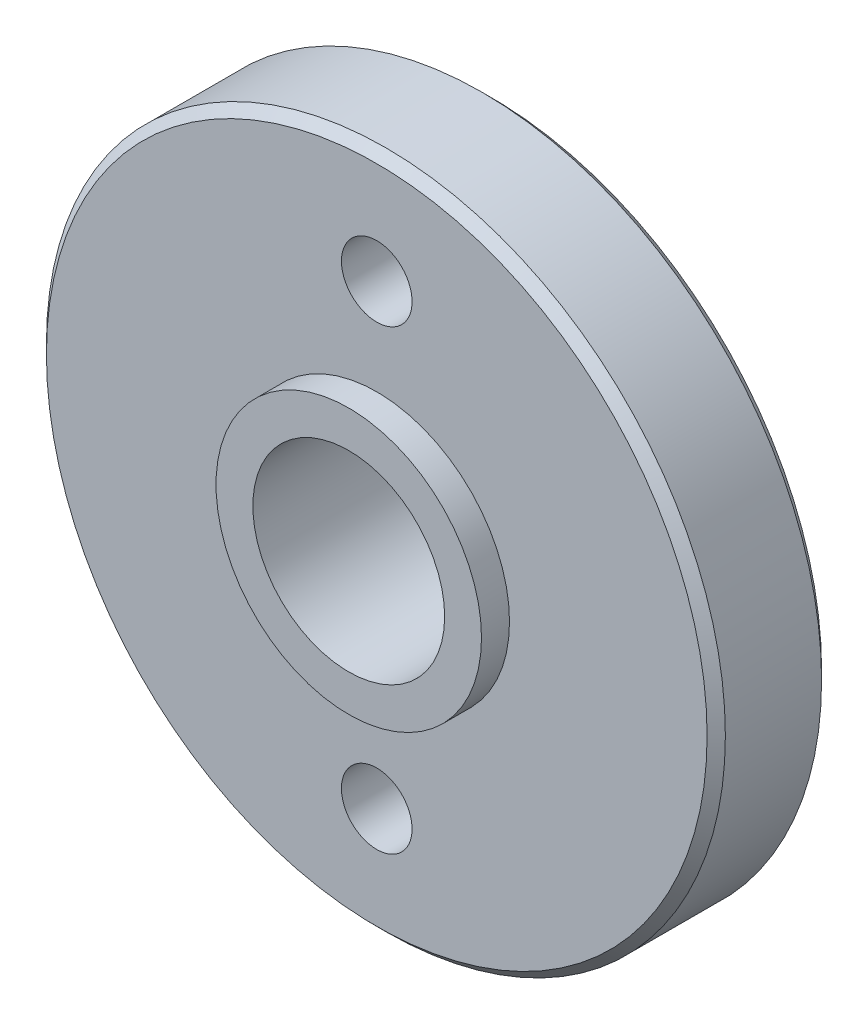
ISO-10303-21;
HEADER;
FILE_DESCRIPTION(('STEP AP214'),'2;1');
FILE_NAME('part.step','',(''),(''),'','','');
FILE_SCHEMA(('AUTOMOTIVE_DESIGN { 1 0 10303 214 1 1 1 1 }'));
ENDSEC;
DATA;
#1=APPLICATION_CONTEXT('core data for automotive mechanical design processes');
#2=APPLICATION_PROTOCOL_DEFINITION('international standard','automotive_design',2000,#1);
#3=PRODUCT_CONTEXT('',#1,'mechanical');
#4=PRODUCT('Part','Part','',(#3));
#5=PRODUCT_RELATED_PRODUCT_CATEGORY('part','',(#4));
#6=PRODUCT_DEFINITION_FORMATION('','',#4);
#7=PRODUCT_DEFINITION_CONTEXT('part definition',#1,'design');
#8=PRODUCT_DEFINITION('design','',#6,#7);
#9=PRODUCT_DEFINITION_SHAPE('','',#8);
#10=(LENGTH_UNIT() NAMED_UNIT(*) SI_UNIT(.MILLI.,.METRE.));
#11=(NAMED_UNIT(*) PLANE_ANGLE_UNIT() SI_UNIT($,.RADIAN.));
#12=(NAMED_UNIT(*) SI_UNIT($,.STERADIAN.) SOLID_ANGLE_UNIT());
#13=UNCERTAINTY_MEASURE_WITH_UNIT(LENGTH_MEASURE(1.E-05),#10,'distance_accuracy_value','');
#14=(GEOMETRIC_REPRESENTATION_CONTEXT(3) GLOBAL_UNCERTAINTY_ASSIGNED_CONTEXT((#13)) GLOBAL_UNIT_ASSIGNED_CONTEXT((#10,
#11,#12)) REPRESENTATION_CONTEXT('',''));
#15=CARTESIAN_POINT('',(0.,0.,0.));
#16=DIRECTION('',(0.,0.,1.));
#17=DIRECTION('',(1.,0.,0.));
#18=AXIS2_PLACEMENT_3D('',#15,#16,#17);
#19=CARTESIAN_POINT('',(0.,5.5626,-4.7752));
#20=DIRECTION('',(0.,0.,1.));
#21=DIRECTION('',(1.,0.,0.));
#22=AXIS2_PLACEMENT_3D('',#19,#20,#21);
#23=PLANE('',#22);
#24=CARTESIAN_POINT('',(0.,9.525,-4.7752));
#25=DIRECTION('',(0.,0.,-1.));
#26=DIRECTION('',(-1.,0.,0.));
#27=AXIS2_PLACEMENT_3D('',#24,#25,#26);
#28=CIRCLE('',#27,1.4732);
#29=CARTESIAN_POINT('',(-1.4732,9.525,-4.7752));
#30=VERTEX_POINT('',#29);
#31=EDGE_CURVE('E173',#30,#30,#28,.T.);
#32=ORIENTED_EDGE('',*,*,#31,.F.);
#33=EDGE_LOOP('',(#32));
#34=FACE_BOUND('',#33,.T.);
#35=CARTESIAN_POINT('',(0.,0.,-4.7752));
#36=DIRECTION('',(0.,0.,1.));
#37=DIRECTION('',(1.,0.,0.));
#38=AXIS2_PLACEMENT_3D('',#35,#36,#37);
#39=CIRCLE('',#38,5.5626);
#40=CARTESIAN_POINT('',(5.5626,0.,-4.7752));
#41=VERTEX_POINT('',#40);
#42=EDGE_CURVE('E68',#41,#41,#39,.T.);
#43=ORIENTED_EDGE('',*,*,#42,.T.);
#44=EDGE_LOOP('',(#43));
#45=FACE_BOUND('',#44,.T.);
#46=CARTESIAN_POINT('',(0.,0.,-4.7752));
#47=DIRECTION('',(0.,0.,1.));
#48=DIRECTION('',(1.,0.,0.));
#49=AXIS2_PLACEMENT_3D('',#46,#47,#48);
#50=CIRCLE('',#49,13.7795);
#51=CARTESIAN_POINT('',(13.7795,0.,-4.7752));
#52=VERTEX_POINT('',#51);
#53=EDGE_CURVE('E87',#52,#52,#50,.F.);
#54=ORIENTED_EDGE('',*,*,#53,.T.);
#55=EDGE_LOOP('',(#54));
#56=FACE_BOUND('',#55,.T.);
#57=CARTESIAN_POINT('',(0.,-9.525,-4.7752));
#58=DIRECTION('',(0.,0.,-1.));
#59=DIRECTION('',(-1.,0.,0.));
#60=AXIS2_PLACEMENT_3D('',#57,#58,#59);
#61=CIRCLE('',#60,1.4732);
#62=CARTESIAN_POINT('',(-1.4732,-9.525,-4.7752));
#63=VERTEX_POINT('',#62);
#64=EDGE_CURVE('E157',#63,#63,#61,.T.);
#65=ORIENTED_EDGE('',*,*,#64,.F.);
#66=EDGE_LOOP('',(#65));
#67=FACE_BOUND('',#66,.T.);
#68=ADVANCED_FACE('F48',(#34,#45,#56,#67),#23,.F.);
#69=CARTESIAN_POINT('',(0.,14.1605,0.));
#70=DIRECTION('',(0.,0.,-1.));
#71=DIRECTION('',(-1.,0.,0.));
#72=AXIS2_PLACEMENT_3D('',#69,#70,#71);
#73=PLANE('',#72);
#74=CARTESIAN_POINT('',(0.,9.525,0.));
#75=DIRECTION('',(0.,0.,-1.));
#76=DIRECTION('',(-1.,0.,0.));
#77=AXIS2_PLACEMENT_3D('',#74,#75,#76);
#78=CIRCLE('',#77,1.4732);
#79=CARTESIAN_POINT('',(-1.4732,9.525,0.));
#80=VERTEX_POINT('',#79);
#81=EDGE_CURVE('E168',#80,#80,#78,.T.);
#82=ORIENTED_EDGE('',*,*,#81,.T.);
#83=EDGE_LOOP('',(#82));
#84=FACE_BOUND('',#83,.T.);
#85=CARTESIAN_POINT('',(0.,-9.525,0.));
#86=DIRECTION('',(0.,0.,-1.));
#87=DIRECTION('',(-1.,0.,0.));
#88=AXIS2_PLACEMENT_3D('',#85,#86,#87);
#89=CIRCLE('',#88,1.4732);
#90=CARTESIAN_POINT('',(-1.4732,-9.525,0.));
#91=VERTEX_POINT('',#90);
#92=EDGE_CURVE('E150',#91,#91,#89,.T.);
#93=ORIENTED_EDGE('',*,*,#92,.T.);
#94=EDGE_LOOP('',(#93));
#95=FACE_BOUND('',#94,.T.);
#96=CARTESIAN_POINT('',(0.,0.,0.));
#97=DIRECTION('',(0.,0.,-1.));
#98=DIRECTION('',(-1.,0.,0.));
#99=AXIS2_PLACEMENT_3D('',#96,#97,#98);
#100=CIRCLE('',#99,13.7795);
#101=CARTESIAN_POINT('',(-13.7795,0.,0.));
#102=VERTEX_POINT('',#101);
#103=EDGE_CURVE('E90',#102,#102,#100,.F.);
#104=ORIENTED_EDGE('',*,*,#103,.T.);
#105=EDGE_LOOP('',(#104));
#106=FACE_BOUND('',#105,.T.);
#107=CARTESIAN_POINT('',(0.,0.,0.));
#108=DIRECTION('',(0.,0.,1.));
#109=DIRECTION('',(1.,0.,0.));
#110=AXIS2_PLACEMENT_3D('',#107,#108,#109);
#111=CIRCLE('',#110,5.5372);
#112=CARTESIAN_POINT('',(5.5372,0.,0.));
#113=VERTEX_POINT('',#112);
#114=EDGE_CURVE('E147',#113,#113,#111,.T.);
#115=ORIENTED_EDGE('',*,*,#114,.F.);
#116=EDGE_LOOP('',(#115));
#117=FACE_BOUND('',#116,.T.);
#118=ADVANCED_FACE('F110',(#84,#95,#106,#117),#73,.F.);
#119=CARTESIAN_POINT('',(0.,0.,-14.8004653109748));
#120=DIRECTION('',(0.,0.,1.));
#121=DIRECTION('',(1.,0.,0.));
#122=AXIS2_PLACEMENT_3D('',#119,#120,#121);
#123=CYLINDRICAL_SURFACE('',#122,14.1605);
#124=CARTESIAN_POINT('',(0.,0.,-4.3942));
#125=DIRECTION('',(0.,0.,1.));
#126=DIRECTION('',(1.,0.,0.));
#127=AXIS2_PLACEMENT_3D('',#124,#125,#126);
#128=CIRCLE('',#127,14.1605);
#129=CARTESIAN_POINT('',(14.1605,0.,-4.3942));
#130=VERTEX_POINT('',#129);
#131=EDGE_CURVE('E84',#130,#130,#128,.T.);
#132=ORIENTED_EDGE('',*,*,#131,.T.);
#133=EDGE_LOOP('',(#132));
#134=FACE_BOUND('',#133,.T.);
#135=CARTESIAN_POINT('',(0.,0.,-0.381000000000001));
#136=DIRECTION('',(0.,0.,-1.));
#137=DIRECTION('',(-1.,0.,0.));
#138=AXIS2_PLACEMENT_3D('',#135,#136,#137);
#139=CIRCLE('',#138,14.1605);
#140=CARTESIAN_POINT('',(-14.1605,0.,-0.381000000000001));
#141=VERTEX_POINT('',#140);
#142=EDGE_CURVE('E73',#141,#141,#139,.T.);
#143=ORIENTED_EDGE('',*,*,#142,.T.);
#144=EDGE_LOOP('',(#143));
#145=FACE_BOUND('',#144,.T.);
#146=ADVANCED_FACE('F116',(#134,#145),#123,.T.);
#147=CARTESIAN_POINT('',(0.,0.,-14.8004653109748));
#148=DIRECTION('',(0.,0.,1.));
#149=DIRECTION('',(1.,0.,0.));
#150=AXIS2_PLACEMENT_3D('',#147,#148,#149);
#151=CYLINDRICAL_SURFACE('',#150,5.5626);
#152=CARTESIAN_POINT('',(0.,0.,-9.652));
#153=DIRECTION('',(0.,0.,1.));
#154=DIRECTION('',(1.,0.,0.));
#155=AXIS2_PLACEMENT_3D('',#152,#153,#154);
#156=CIRCLE('',#155,5.5626);
#157=CARTESIAN_POINT('',(5.5626,0.,-9.652));
#158=VERTEX_POINT('',#157);
#159=EDGE_CURVE('E55',#158,#158,#156,.T.);
#160=ORIENTED_EDGE('',*,*,#159,.T.);
#161=EDGE_LOOP('',(#160));
#162=FACE_BOUND('',#161,.T.);
#163=ORIENTED_EDGE('',*,*,#42,.F.);
#164=EDGE_LOOP('',(#163));
#165=FACE_BOUND('',#164,.T.);
#166=ADVANCED_FACE('F96',(#162,#165),#151,.T.);
#167=CARTESIAN_POINT('',(0.,5.5626,-11.684));
#168=DIRECTION('',(0.,0.,1.));
#169=DIRECTION('',(1.,0.,0.));
#170=AXIS2_PLACEMENT_3D('',#167,#168,#169);
#171=PLANE('',#170);
#172=CARTESIAN_POINT('',(0.,0.,-11.684));
#173=DIRECTION('',(0.,0.,1.));
#174=DIRECTION('',(1.,0.,0.));
#175=AXIS2_PLACEMENT_3D('',#172,#173,#174);
#176=CIRCLE('',#175,3.53059999999999);
#177=CARTESIAN_POINT('',(3.53059999999999,0.,-11.684));
#178=VERTEX_POINT('',#177);
#179=EDGE_CURVE('E12',#178,#178,#176,.F.);
#180=ORIENTED_EDGE('',*,*,#179,.T.);
#181=EDGE_LOOP('',(#180));
#182=FACE_BOUND('',#181,.T.);
#183=ADVANCED_FACE('F62',(#182),#171,.F.);
#184=CARTESIAN_POINT('',(0.,0.,-8.3566));
#185=DIRECTION('',(0.,0.,1.));
#186=DIRECTION('',(1.,0.,0.));
#187=AXIS2_PLACEMENT_3D('',#184,#185,#186);
#188=CONICAL_SURFACE('',#187,4.0005,1.02974425867666);
#189=CARTESIAN_POINT('',(0.,0.,-10.7603429064197));
#190=VERTEX_POINT('',#189);
#191=VERTEX_LOOP('',#190);
#192=FACE_BOUND('',#191,.T.);
#193=CARTESIAN_POINT('',(0.,0.,-8.3566));
#194=DIRECTION('',(0.,0.,1.));
#195=DIRECTION('',(1.,0.,0.));
#196=AXIS2_PLACEMENT_3D('',#193,#194,#195);
#197=CIRCLE('',#196,4.0005);
#198=CARTESIAN_POINT('',(4.0005,0.,-8.3566));
#199=VERTEX_POINT('',#198);
#200=EDGE_CURVE('E66',#199,#199,#197,.T.);
#201=ORIENTED_EDGE('',*,*,#200,.T.);
#202=EDGE_LOOP('',(#201));
#203=FACE_BOUND('',#202,.T.);
#204=ADVANCED_FACE('F58',(#192,#203),#188,.F.);
#205=CARTESIAN_POINT('',(0.,0.,-14.8004653109748));
#206=DIRECTION('',(0.,0.,1.));
#207=DIRECTION('',(1.,0.,0.));
#208=AXIS2_PLACEMENT_3D('',#205,#206,#207);
#209=CYLINDRICAL_SURFACE('',#208,4.0005);
#210=ORIENTED_EDGE('',*,*,#200,.F.);
#211=EDGE_LOOP('',(#210));
#212=FACE_BOUND('',#211,.T.);
#213=CARTESIAN_POINT('',(0.,0.,1.1684));
#214=DIRECTION('',(0.,0.,1.));
#215=DIRECTION('',(1.,0.,0.));
#216=AXIS2_PLACEMENT_3D('',#213,#214,#215);
#217=CIRCLE('',#216,4.0005);
#218=CARTESIAN_POINT('',(4.0005,0.,1.1684));
#219=VERTEX_POINT('',#218);
#220=EDGE_CURVE('E69',#219,#219,#217,.T.);
#221=ORIENTED_EDGE('',*,*,#220,.T.);
#222=EDGE_LOOP('',(#221));
#223=FACE_BOUND('',#222,.T.);
#224=ADVANCED_FACE('F61',(#212,#223),#209,.F.);
#225=CARTESIAN_POINT('',(0.,5.5372,1.1684));
#226=DIRECTION('',(0.,0.,-1.));
#227=DIRECTION('',(-1.,0.,0.));
#228=AXIS2_PLACEMENT_3D('',#225,#226,#227);
#229=PLANE('',#228);
#230=ORIENTED_EDGE('',*,*,#220,.F.);
#231=EDGE_LOOP('',(#230));
#232=FACE_BOUND('',#231,.T.);
#233=CARTESIAN_POINT('',(0.,0.,1.1684));
#234=DIRECTION('',(0.,0.,1.));
#235=DIRECTION('',(1.,0.,0.));
#236=AXIS2_PLACEMENT_3D('',#233,#234,#235);
#237=CIRCLE('',#236,5.5372);
#238=CARTESIAN_POINT('',(5.5372,0.,1.1684));
#239=VERTEX_POINT('',#238);
#240=EDGE_CURVE('E76',#239,#239,#237,.T.);
#241=ORIENTED_EDGE('',*,*,#240,.T.);
#242=EDGE_LOOP('',(#241));
#243=FACE_BOUND('',#242,.T.);
#244=ADVANCED_FACE('F236',(#232,#243),#229,.F.);
#245=CARTESIAN_POINT('',(0.,0.,-14.8004653109748));
#246=DIRECTION('',(0.,0.,1.));
#247=DIRECTION('',(1.,0.,0.));
#248=AXIS2_PLACEMENT_3D('',#245,#246,#247);
#249=CYLINDRICAL_SURFACE('',#248,5.5372);
#250=ORIENTED_EDGE('',*,*,#240,.F.);
#251=EDGE_LOOP('',(#250));
#252=FACE_BOUND('',#251,.T.);
#253=ORIENTED_EDGE('',*,*,#114,.T.);
#254=EDGE_LOOP('',(#253));
#255=FACE_BOUND('',#254,.T.);
#256=ADVANCED_FACE('F131',(#252,#255),#249,.T.);
#257=CARTESIAN_POINT('',(0.,0.,-4.3942));
#258=DIRECTION('',(0.,0.,1.));
#259=DIRECTION('',(1.,0.,0.));
#260=AXIS2_PLACEMENT_3D('',#257,#258,#259);
#261=CONICAL_SURFACE('',#260,14.1605,0.785398163397448);
#262=ORIENTED_EDGE('',*,*,#53,.F.);
#263=EDGE_LOOP('',(#262));
#264=FACE_BOUND('',#263,.T.);
#265=ORIENTED_EDGE('',*,*,#131,.F.);
#266=EDGE_LOOP('',(#265));
#267=FACE_BOUND('',#266,.T.);
#268=ADVANCED_FACE('F128',(#264,#267),#261,.T.);
#269=CARTESIAN_POINT('',(0.,0.,0.));
#270=DIRECTION('',(0.,0.,-1.));
#271=DIRECTION('',(-1.,0.,0.));
#272=AXIS2_PLACEMENT_3D('',#269,#270,#271);
#273=CONICAL_SURFACE('',#272,13.7795,0.785398163397437);
#274=ORIENTED_EDGE('',*,*,#142,.F.);
#275=EDGE_LOOP('',(#274));
#276=FACE_BOUND('',#275,.T.);
#277=ORIENTED_EDGE('',*,*,#103,.F.);
#278=EDGE_LOOP('',(#277));
#279=FACE_BOUND('',#278,.T.);
#280=ADVANCED_FACE('F130',(#276,#279),#273,.T.);
#281=CARTESIAN_POINT('',(0.,-9.525,-4.7752));
#282=DIRECTION('',(0.,0.,-1.));
#283=DIRECTION('',(-1.,0.,0.));
#284=AXIS2_PLACEMENT_3D('',#281,#282,#283);
#285=CYLINDRICAL_SURFACE('',#284,1.4732);
#286=ORIENTED_EDGE('',*,*,#92,.F.);
#287=EDGE_LOOP('',(#286));
#288=FACE_BOUND('',#287,.T.);
#289=ORIENTED_EDGE('',*,*,#64,.T.);
#290=EDGE_LOOP('',(#289));
#291=FACE_BOUND('',#290,.T.);
#292=ADVANCED_FACE('F105',(#288,#291),#285,.F.);
#293=CARTESIAN_POINT('',(0.,9.525,-4.7752));
#294=DIRECTION('',(0.,0.,-1.));
#295=DIRECTION('',(-1.,0.,0.));
#296=AXIS2_PLACEMENT_3D('',#293,#294,#295);
#297=CYLINDRICAL_SURFACE('',#296,1.4732);
#298=ORIENTED_EDGE('',*,*,#81,.F.);
#299=EDGE_LOOP('',(#298));
#300=FACE_BOUND('',#299,.T.);
#301=ORIENTED_EDGE('',*,*,#31,.T.);
#302=EDGE_LOOP('',(#301));
#303=FACE_BOUND('',#302,.T.);
#304=ADVANCED_FACE('F100',(#300,#303),#297,.F.);
#305=CARTESIAN_POINT('',(0.,0.,-9.652));
#306=DIRECTION('',(0.,0.,1.));
#307=DIRECTION('',(1.,0.,0.));
#308=AXIS2_PLACEMENT_3D('',#305,#306,#307);
#309=CONICAL_SURFACE('',#308,5.5626,0.785398163397451);
#310=ORIENTED_EDGE('',*,*,#179,.F.);
#311=EDGE_LOOP('',(#310));
#312=FACE_BOUND('',#311,.T.);
#313=ORIENTED_EDGE('',*,*,#159,.F.);
#314=EDGE_LOOP('',(#313));
#315=FACE_BOUND('',#314,.T.);
#316=ADVANCED_FACE('F50',(#312,#315),#309,.T.);
#317=CLOSED_SHELL('',(#68,#118,#146,#166,#183,#204,#224,#244,#256,#268,#280,#292,#304,#316));
#318=MANIFOLD_SOLID_BREP('B2',#317);
#319=ADVANCED_BREP_SHAPE_REPRESENTATION('',(#18,#318),#14);
#320=SHAPE_DEFINITION_REPRESENTATION(#9,#319);
ENDSEC;
END-ISO-10303-21;
